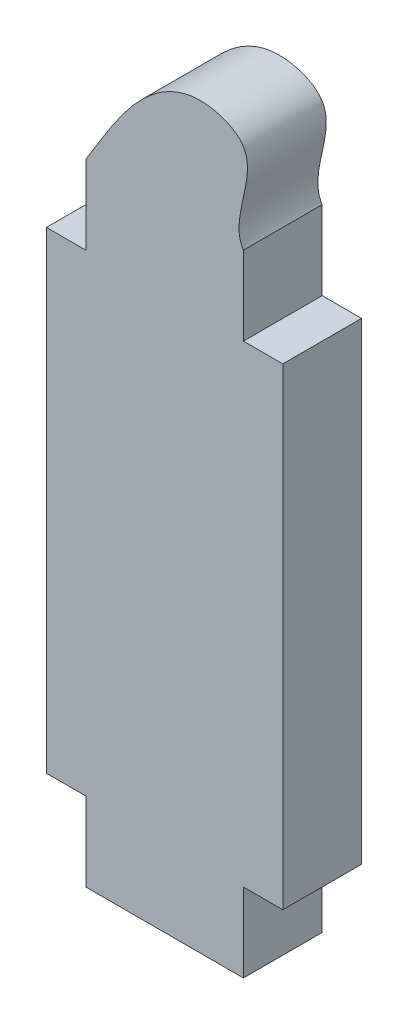
ISO-10303-21;
HEADER;
FILE_DESCRIPTION(('STEP AP214'),'2;1');
FILE_NAME('part.step','',(''),(''),'','','');
FILE_SCHEMA(('AUTOMOTIVE_DESIGN { 1 0 10303 214 1 1 1 1 }'));
ENDSEC;
DATA;
#1=APPLICATION_CONTEXT('core data for automotive mechanical design processes');
#2=APPLICATION_PROTOCOL_DEFINITION('international standard','automotive_design',2000,#1);
#3=PRODUCT_CONTEXT('',#1,'mechanical');
#4=PRODUCT('Part','Part','',(#3));
#5=PRODUCT_RELATED_PRODUCT_CATEGORY('part','',(#4));
#6=PRODUCT_DEFINITION_FORMATION('','',#4);
#7=PRODUCT_DEFINITION_CONTEXT('part definition',#1,'design');
#8=PRODUCT_DEFINITION('design','',#6,#7);
#9=PRODUCT_DEFINITION_SHAPE('','',#8);
#10=(LENGTH_UNIT() NAMED_UNIT(*) SI_UNIT(.MILLI.,.METRE.));
#11=(NAMED_UNIT(*) PLANE_ANGLE_UNIT() SI_UNIT($,.RADIAN.));
#12=(NAMED_UNIT(*) SI_UNIT($,.STERADIAN.) SOLID_ANGLE_UNIT());
#13=UNCERTAINTY_MEASURE_WITH_UNIT(LENGTH_MEASURE(1.E-05),#10,'distance_accuracy_value','');
#14=(GEOMETRIC_REPRESENTATION_CONTEXT(3) GLOBAL_UNCERTAINTY_ASSIGNED_CONTEXT((#13)) GLOBAL_UNIT_ASSIGNED_CONTEXT((#10,
#11,#12)) REPRESENTATION_CONTEXT('',''));
#15=CARTESIAN_POINT('',(0.,0.,0.));
#16=DIRECTION('',(0.,0.,1.));
#17=DIRECTION('',(1.,0.,0.));
#18=AXIS2_PLACEMENT_3D('',#15,#16,#17);
#19=CARTESIAN_POINT('',(-4.7625,0.,3.175));
#20=DIRECTION('',(-1.,0.,0.));
#21=DIRECTION('',(0.,0.,1.));
#22=AXIS2_PLACEMENT_3D('',#19,#20,#21);
#23=PLANE('',#22);
#24=DIRECTION('',(0.,1.,0.));
#25=VECTOR('',#24,1.);
#26=CARTESIAN_POINT('',(-4.7625,0.,0.));
#27=LINE('',#26,#25);
#28=CARTESIAN_POINT('',(-4.7625,-9.525,0.));
#29=VERTEX_POINT('',#28);
#30=CARTESIAN_POINT('',(-4.7625,9.525,0.));
#31=VERTEX_POINT('',#30);
#32=EDGE_CURVE('E153',#29,#31,#27,.T.);
#33=ORIENTED_EDGE('',*,*,#32,.F.);
#34=DIRECTION('',(0.,0.,-1.));
#35=VECTOR('',#34,1.);
#36=CARTESIAN_POINT('',(-4.7625,-9.525,3.175));
#37=LINE('',#36,#35);
#38=CARTESIAN_POINT('',(-4.7625,-9.525,3.175));
#39=VERTEX_POINT('',#38);
#40=EDGE_CURVE('E11',#39,#29,#37,.T.);
#41=ORIENTED_EDGE('',*,*,#40,.F.);
#42=DIRECTION('',(0.,1.,0.));
#43=VECTOR('',#42,1.);
#44=CARTESIAN_POINT('',(-4.7625,0.,3.175));
#45=LINE('',#44,#43);
#46=CARTESIAN_POINT('',(-4.7625,9.525,3.175));
#47=VERTEX_POINT('',#46);
#48=EDGE_CURVE('E216',#39,#47,#45,.T.);
#49=ORIENTED_EDGE('',*,*,#48,.T.);
#50=DIRECTION('',(0.,0.,-1.));
#51=VECTOR('',#50,1.);
#52=CARTESIAN_POINT('',(-4.7625,9.525,3.175));
#53=LINE('',#52,#51);
#54=EDGE_CURVE('E95',#47,#31,#53,.T.);
#55=ORIENTED_EDGE('',*,*,#54,.T.);
#56=EDGE_LOOP('',(#33,#41,#49,#55));
#57=FACE_BOUND('',#56,.T.);
#58=ADVANCED_FACE('F33',(#57),#23,.T.);
#59=CARTESIAN_POINT('',(0.,-9.525,3.175));
#60=DIRECTION('',(0.,-1.,0.));
#61=DIRECTION('',(0.,0.,-1.));
#62=AXIS2_PLACEMENT_3D('',#59,#60,#61);
#63=PLANE('',#62);
#64=DIRECTION('',(-1.,0.,0.));
#65=VECTOR('',#64,1.);
#66=CARTESIAN_POINT('',(0.,-9.525,0.));
#67=LINE('',#66,#65);
#68=CARTESIAN_POINT('',(-3.175,-9.525,0.));
#69=VERTEX_POINT('',#68);
#70=EDGE_CURVE('E156',#69,#29,#67,.T.);
#71=ORIENTED_EDGE('',*,*,#70,.F.);
#72=DIRECTION('',(0.,0.,-1.));
#73=VECTOR('',#72,1.);
#74=CARTESIAN_POINT('',(-3.175,-9.525,3.175));
#75=LINE('',#74,#73);
#76=CARTESIAN_POINT('',(-3.175,-9.525,3.175));
#77=VERTEX_POINT('',#76);
#78=EDGE_CURVE('E41',#77,#69,#75,.T.);
#79=ORIENTED_EDGE('',*,*,#78,.F.);
#80=DIRECTION('',(-1.,0.,0.));
#81=VECTOR('',#80,1.);
#82=CARTESIAN_POINT('',(0.,-9.525,3.175));
#83=LINE('',#82,#81);
#84=EDGE_CURVE('E215',#77,#39,#83,.T.);
#85=ORIENTED_EDGE('',*,*,#84,.T.);
#86=ORIENTED_EDGE('',*,*,#40,.T.);
#87=EDGE_LOOP('',(#71,#79,#85,#86));
#88=FACE_BOUND('',#87,.T.);
#89=ADVANCED_FACE('F214',(#88),#63,.T.);
#90=CARTESIAN_POINT('',(-3.17500000000001,0.,3.175));
#91=DIRECTION('',(1.,0.,0.));
#92=DIRECTION('',(0.,1.,0.));
#93=AXIS2_PLACEMENT_3D('',#90,#91,#92);
#94=PLANE('',#93);
#95=DIRECTION('',(0.,-1.,0.));
#96=VECTOR('',#95,1.);
#97=CARTESIAN_POINT('',(-3.17500000000001,0.,0.));
#98=LINE('',#97,#96);
#99=CARTESIAN_POINT('',(-3.175,-12.7,0.));
#100=VERTEX_POINT('',#99);
#101=EDGE_CURVE('E159',#69,#100,#98,.T.);
#102=ORIENTED_EDGE('',*,*,#101,.T.);
#103=DIRECTION('',(0.,0.,-1.));
#104=VECTOR('',#103,1.);
#105=CARTESIAN_POINT('',(-3.175,-12.7,3.175));
#106=LINE('',#105,#104);
#107=CARTESIAN_POINT('',(-3.175,-12.7,3.175));
#108=VERTEX_POINT('',#107);
#109=EDGE_CURVE('E199',#108,#100,#106,.T.);
#110=ORIENTED_EDGE('',*,*,#109,.F.);
#111=DIRECTION('',(0.,-1.,0.));
#112=VECTOR('',#111,1.);
#113=CARTESIAN_POINT('',(-3.17500000000001,0.,3.175));
#114=LINE('',#113,#112);
#115=EDGE_CURVE('E206',#77,#108,#114,.T.);
#116=ORIENTED_EDGE('',*,*,#115,.F.);
#117=ORIENTED_EDGE('',*,*,#78,.T.);
#118=EDGE_LOOP('',(#102,#110,#116,#117));
#119=FACE_BOUND('',#118,.T.);
#120=ADVANCED_FACE('F204',(#119),#94,.F.);
#121=CARTESIAN_POINT('',(0.,-12.7,3.175));
#122=DIRECTION('',(0.,1.,0.));
#123=DIRECTION('',(0.,0.,1.));
#124=AXIS2_PLACEMENT_3D('',#121,#122,#123);
#125=PLANE('',#124);
#126=DIRECTION('',(1.,0.,0.));
#127=VECTOR('',#126,1.);
#128=CARTESIAN_POINT('',(0.,-12.7,0.));
#129=LINE('',#128,#127);
#130=CARTESIAN_POINT('',(3.175,-12.7,0.));
#131=VERTEX_POINT('',#130);
#132=EDGE_CURVE('E162',#100,#131,#129,.T.);
#133=ORIENTED_EDGE('',*,*,#132,.T.);
#134=DIRECTION('',(0.,0.,-1.));
#135=VECTOR('',#134,1.);
#136=CARTESIAN_POINT('',(3.175,-12.7,3.175));
#137=LINE('',#136,#135);
#138=CARTESIAN_POINT('',(3.175,-12.7,3.175));
#139=VERTEX_POINT('',#138);
#140=EDGE_CURVE('E197',#139,#131,#137,.T.);
#141=ORIENTED_EDGE('',*,*,#140,.F.);
#142=DIRECTION('',(1.,0.,0.));
#143=VECTOR('',#142,1.);
#144=CARTESIAN_POINT('',(0.,-12.7,3.175));
#145=LINE('',#144,#143);
#146=EDGE_CURVE('E222',#108,#139,#145,.T.);
#147=ORIENTED_EDGE('',*,*,#146,.F.);
#148=ORIENTED_EDGE('',*,*,#109,.T.);
#149=EDGE_LOOP('',(#133,#141,#147,#148));
#150=FACE_BOUND('',#149,.T.);
#151=ADVANCED_FACE('F253',(#150),#125,.F.);
#152=CARTESIAN_POINT('',(3.17499999999999,0.,3.175));
#153=DIRECTION('',(1.,0.,0.));
#154=DIRECTION('',(0.,1.,0.));
#155=AXIS2_PLACEMENT_3D('',#152,#153,#154);
#156=PLANE('',#155);
#157=DIRECTION('',(0.,-1.,0.));
#158=VECTOR('',#157,1.);
#159=CARTESIAN_POINT('',(3.17499999999999,0.,0.));
#160=LINE('',#159,#158);
#161=CARTESIAN_POINT('',(3.175,-9.525,0.));
#162=VERTEX_POINT('',#161);
#163=EDGE_CURVE('E165',#162,#131,#160,.T.);
#164=ORIENTED_EDGE('',*,*,#163,.F.);
#165=DIRECTION('',(0.,0.,-1.));
#166=VECTOR('',#165,1.);
#167=CARTESIAN_POINT('',(3.175,-9.525,3.175));
#168=LINE('',#167,#166);
#169=CARTESIAN_POINT('',(3.175,-9.525,3.175));
#170=VERTEX_POINT('',#169);
#171=EDGE_CURVE('E195',#170,#162,#168,.T.);
#172=ORIENTED_EDGE('',*,*,#171,.F.);
#173=DIRECTION('',(0.,-1.,0.));
#174=VECTOR('',#173,1.);
#175=CARTESIAN_POINT('',(3.17499999999999,0.,3.175));
#176=LINE('',#175,#174);
#177=EDGE_CURVE('E224',#170,#139,#176,.T.);
#178=ORIENTED_EDGE('',*,*,#177,.T.);
#179=ORIENTED_EDGE('',*,*,#140,.T.);
#180=EDGE_LOOP('',(#164,#172,#178,#179));
#181=FACE_BOUND('',#180,.T.);
#182=ADVANCED_FACE('F249',(#181),#156,.T.);
#183=CARTESIAN_POINT('',(4.7625,-9.525,0.));
#184=VERTEX_POINT('',#183);
#185=EDGE_CURVE('E160',#184,#162,#67,.T.);
#186=ORIENTED_EDGE('',*,*,#185,.F.);
#187=DIRECTION('',(0.,0.,-1.));
#188=VECTOR('',#187,1.);
#189=CARTESIAN_POINT('',(4.7625,-9.525,3.175));
#190=LINE('',#189,#188);
#191=CARTESIAN_POINT('',(4.7625,-9.525,3.175));
#192=VERTEX_POINT('',#191);
#193=EDGE_CURVE('E193',#192,#184,#190,.T.);
#194=ORIENTED_EDGE('',*,*,#193,.F.);
#195=EDGE_CURVE('E219',#192,#170,#83,.T.);
#196=ORIENTED_EDGE('',*,*,#195,.T.);
#197=ORIENTED_EDGE('',*,*,#171,.T.);
#198=EDGE_LOOP('',(#186,#194,#196,#197));
#199=FACE_BOUND('',#198,.T.);
#200=ADVANCED_FACE('F244',(#199),#63,.T.);
#201=CARTESIAN_POINT('',(4.7625,0.,3.175));
#202=DIRECTION('',(-1.,0.,0.));
#203=DIRECTION('',(0.,0.,1.));
#204=AXIS2_PLACEMENT_3D('',#201,#202,#203);
#205=PLANE('',#204);
#206=DIRECTION('',(0.,1.,0.));
#207=VECTOR('',#206,1.);
#208=CARTESIAN_POINT('',(4.7625,0.,0.));
#209=LINE('',#208,#207);
#210=CARTESIAN_POINT('',(4.7625,9.525,0.));
#211=VERTEX_POINT('',#210);
#212=EDGE_CURVE('E168',#184,#211,#209,.T.);
#213=ORIENTED_EDGE('',*,*,#212,.T.);
#214=DIRECTION('',(0.,0.,-1.));
#215=VECTOR('',#214,1.);
#216=CARTESIAN_POINT('',(4.7625,9.525,3.175));
#217=LINE('',#216,#215);
#218=CARTESIAN_POINT('',(4.7625,9.525,3.175));
#219=VERTEX_POINT('',#218);
#220=EDGE_CURVE('E190',#219,#211,#217,.T.);
#221=ORIENTED_EDGE('',*,*,#220,.F.);
#222=DIRECTION('',(0.,1.,0.));
#223=VECTOR('',#222,1.);
#224=CARTESIAN_POINT('',(4.7625,0.,3.175));
#225=LINE('',#224,#223);
#226=EDGE_CURVE('E227',#192,#219,#225,.T.);
#227=ORIENTED_EDGE('',*,*,#226,.F.);
#228=ORIENTED_EDGE('',*,*,#193,.T.);
#229=EDGE_LOOP('',(#213,#221,#227,#228));
#230=FACE_BOUND('',#229,.T.);
#231=ADVANCED_FACE('F270',(#230),#205,.F.);
#232=CARTESIAN_POINT('',(0.,9.525,3.175));
#233=DIRECTION('',(0.,-1.,0.));
#234=DIRECTION('',(0.,0.,-1.));
#235=AXIS2_PLACEMENT_3D('',#232,#233,#234);
#236=PLANE('',#235);
#237=DIRECTION('',(-1.,0.,0.));
#238=VECTOR('',#237,1.);
#239=CARTESIAN_POINT('',(0.,9.525,0.));
#240=LINE('',#239,#238);
#241=CARTESIAN_POINT('',(3.175,9.525,0.));
#242=VERTEX_POINT('',#241);
#243=EDGE_CURVE('E170',#211,#242,#240,.T.);
#244=ORIENTED_EDGE('',*,*,#243,.T.);
#245=DIRECTION('',(0.,0.,-1.));
#246=VECTOR('',#245,1.);
#247=CARTESIAN_POINT('',(3.175,9.525,3.175));
#248=LINE('',#247,#246);
#249=CARTESIAN_POINT('',(3.175,9.525,3.175));
#250=VERTEX_POINT('',#249);
#251=EDGE_CURVE('E187',#250,#242,#248,.T.);
#252=ORIENTED_EDGE('',*,*,#251,.F.);
#253=DIRECTION('',(-1.,0.,0.));
#254=VECTOR('',#253,1.);
#255=CARTESIAN_POINT('',(0.,9.525,3.175));
#256=LINE('',#255,#254);
#257=EDGE_CURVE('E147',#219,#250,#256,.T.);
#258=ORIENTED_EDGE('',*,*,#257,.F.);
#259=ORIENTED_EDGE('',*,*,#220,.T.);
#260=EDGE_LOOP('',(#244,#252,#258,#259));
#261=FACE_BOUND('',#260,.T.);
#262=ADVANCED_FACE('F234',(#261),#236,.F.);
#263=CARTESIAN_POINT('',(3.175,0.,3.175));
#264=DIRECTION('',(-1.,0.,0.));
#265=DIRECTION('',(0.,0.,1.));
#266=AXIS2_PLACEMENT_3D('',#263,#264,#265);
#267=PLANE('',#266);
#268=DIRECTION('',(0.,1.,0.));
#269=VECTOR('',#268,1.);
#270=CARTESIAN_POINT('',(3.175,0.,0.));
#271=LINE('',#270,#269);
#272=CARTESIAN_POINT('',(3.175,12.7,0.));
#273=VERTEX_POINT('',#272);
#274=EDGE_CURVE('E172',#242,#273,#271,.T.);
#275=ORIENTED_EDGE('',*,*,#274,.T.);
#276=DIRECTION('',(0.,0.,-1.));
#277=VECTOR('',#276,1.);
#278=CARTESIAN_POINT('',(3.175,12.7,3.175));
#279=LINE('',#278,#277);
#280=CARTESIAN_POINT('',(3.175,12.7,3.175));
#281=VERTEX_POINT('',#280);
#282=EDGE_CURVE('E136',#281,#273,#279,.T.);
#283=ORIENTED_EDGE('',*,*,#282,.F.);
#284=DIRECTION('',(0.,1.,0.));
#285=VECTOR('',#284,1.);
#286=CARTESIAN_POINT('',(3.175,0.,3.175));
#287=LINE('',#286,#285);
#288=EDGE_CURVE('E141',#250,#281,#287,.T.);
#289=ORIENTED_EDGE('',*,*,#288,.F.);
#290=ORIENTED_EDGE('',*,*,#251,.T.);
#291=EDGE_LOOP('',(#275,#283,#289,#290));
#292=FACE_BOUND('',#291,.T.);
#293=ADVANCED_FACE('F238',(#292),#267,.F.);
#294=CARTESIAN_POINT('',(-3.175,12.7,3.175));
#295=CARTESIAN_POINT('',(-2.2138117611379,14.1735923111968,3.175));
#296=CARTESIAN_POINT('',(-0.385937212467638,17.9716877260222,3.175));
#297=CARTESIAN_POINT('',(4.31508925997065,16.2397463109345,3.175));
#298=CARTESIAN_POINT('',(2.57651001553073,13.6162403457416,3.175));
#299=CARTESIAN_POINT('',(3.175,12.7,3.175));
#300=B_SPLINE_CURVE_WITH_KNOTS('',3,(#294,#295,#296,#297,#298,#299),.UNSPECIFIED.,.F.,.F.,(4,1,
1,4),(0.,0.552544754896248,0.698480670384451,1.),.UNSPECIFIED.);
#301=DIRECTION('',(0.,0.,-1.));
#302=VECTOR('',#301,1.);
#303=SURFACE_OF_LINEAR_EXTRUSION('',#300,#302);
#304=CARTESIAN_POINT('',(-3.175,12.7,0.));
#305=CARTESIAN_POINT('',(-2.2138117611379,14.1735923111968,0.));
#306=CARTESIAN_POINT('',(-0.385937212467638,17.9716877260222,0.));
#307=CARTESIAN_POINT('',(4.31508925997065,16.2397463109345,0.));
#308=CARTESIAN_POINT('',(2.57651001553073,13.6162403457416,0.));
#309=CARTESIAN_POINT('',(3.175,12.7,0.));
#310=B_SPLINE_CURVE_WITH_KNOTS('',3,(#304,#305,#306,#307,#308,#309),.UNSPECIFIED.,.F.,.F.,(4,1,
1,4),(0.,0.552544754896248,0.698480670384451,1.),.UNSPECIFIED.);
#311=CARTESIAN_POINT('',(-3.175,12.7,0.));
#312=VERTEX_POINT('',#311);
#313=EDGE_CURVE('E131',#312,#273,#310,.T.);
#314=ORIENTED_EDGE('',*,*,#313,.F.);
#315=DIRECTION('',(0.,0.,-1.));
#316=VECTOR('',#315,1.);
#317=CARTESIAN_POINT('',(-3.175,12.7,3.175));
#318=LINE('',#317,#316);
#319=CARTESIAN_POINT('',(-3.175,12.7,3.175));
#320=VERTEX_POINT('',#319);
#321=EDGE_CURVE('E126',#320,#312,#318,.T.);
#322=ORIENTED_EDGE('',*,*,#321,.F.);
#323=EDGE_CURVE('E129',#320,#281,#300,.T.);
#324=ORIENTED_EDGE('',*,*,#323,.T.);
#325=ORIENTED_EDGE('',*,*,#282,.T.);
#326=EDGE_LOOP('',(#314,#322,#324,#325));
#327=FACE_BOUND('',#326,.T.);
#328=ADVANCED_FACE('F128',(#327),#303,.T.);
#329=CARTESIAN_POINT('',(-3.175,0.,3.175));
#330=DIRECTION('',(-1.,0.,0.));
#331=DIRECTION('',(0.,0.,1.));
#332=AXIS2_PLACEMENT_3D('',#329,#330,#331);
#333=PLANE('',#332);
#334=DIRECTION('',(0.,1.,0.));
#335=VECTOR('',#334,1.);
#336=CARTESIAN_POINT('',(-3.175,0.,0.));
#337=LINE('',#336,#335);
#338=CARTESIAN_POINT('',(-3.175,9.525,0.));
#339=VERTEX_POINT('',#338);
#340=EDGE_CURVE('E179',#339,#312,#337,.T.);
#341=ORIENTED_EDGE('',*,*,#340,.F.);
#342=DIRECTION('',(0.,0.,-1.));
#343=VECTOR('',#342,1.);
#344=CARTESIAN_POINT('',(-3.175,9.525,3.175));
#345=LINE('',#344,#343);
#346=CARTESIAN_POINT('',(-3.175,9.525,3.175));
#347=VERTEX_POINT('',#346);
#348=EDGE_CURVE('E88',#347,#339,#345,.T.);
#349=ORIENTED_EDGE('',*,*,#348,.F.);
#350=DIRECTION('',(0.,1.,0.));
#351=VECTOR('',#350,1.);
#352=CARTESIAN_POINT('',(-3.175,0.,3.175));
#353=LINE('',#352,#351);
#354=EDGE_CURVE('E139',#347,#320,#353,.T.);
#355=ORIENTED_EDGE('',*,*,#354,.T.);
#356=ORIENTED_EDGE('',*,*,#321,.T.);
#357=EDGE_LOOP('',(#341,#349,#355,#356));
#358=FACE_BOUND('',#357,.T.);
#359=ADVANCED_FACE('F144',(#358),#333,.T.);
#360=EDGE_CURVE('E173',#339,#31,#240,.T.);
#361=ORIENTED_EDGE('',*,*,#360,.T.);
#362=ORIENTED_EDGE('',*,*,#54,.F.);
#363=EDGE_CURVE('E49',#347,#47,#256,.T.);
#364=ORIENTED_EDGE('',*,*,#363,.F.);
#365=ORIENTED_EDGE('',*,*,#348,.T.);
#366=EDGE_LOOP('',(#361,#362,#364,#365));
#367=FACE_BOUND('',#366,.T.);
#368=ADVANCED_FACE('F278',(#367),#236,.F.);
#369=CARTESIAN_POINT('',(0.,0.,3.175));
#370=DIRECTION('',(0.,0.,1.));
#371=DIRECTION('',(1.,0.,0.));
#372=AXIS2_PLACEMENT_3D('',#369,#370,#371);
#373=PLANE('',#372);
#374=ORIENTED_EDGE('',*,*,#48,.F.);
#375=ORIENTED_EDGE('',*,*,#84,.F.);
#376=ORIENTED_EDGE('',*,*,#115,.T.);
#377=ORIENTED_EDGE('',*,*,#146,.T.);
#378=ORIENTED_EDGE('',*,*,#177,.F.);
#379=ORIENTED_EDGE('',*,*,#195,.F.);
#380=ORIENTED_EDGE('',*,*,#226,.T.);
#381=ORIENTED_EDGE('',*,*,#257,.T.);
#382=ORIENTED_EDGE('',*,*,#288,.T.);
#383=ORIENTED_EDGE('',*,*,#323,.F.);
#384=ORIENTED_EDGE('',*,*,#354,.F.);
#385=ORIENTED_EDGE('',*,*,#363,.T.);
#386=EDGE_LOOP('',(#374,#375,#376,#377,#378,#379,#380,#381,#382,#383,#384,#385));
#387=FACE_BOUND('',#386,.T.);
#388=ADVANCED_FACE('F138',(#387),#373,.T.);
#389=CARTESIAN_POINT('',(0.,0.,0.));
#390=DIRECTION('',(0.,0.,1.));
#391=DIRECTION('',(1.,0.,0.));
#392=AXIS2_PLACEMENT_3D('',#389,#390,#391);
#393=PLANE('',#392);
#394=ORIENTED_EDGE('',*,*,#32,.T.);
#395=ORIENTED_EDGE('',*,*,#360,.F.);
#396=ORIENTED_EDGE('',*,*,#340,.T.);
#397=ORIENTED_EDGE('',*,*,#313,.T.);
#398=ORIENTED_EDGE('',*,*,#274,.F.);
#399=ORIENTED_EDGE('',*,*,#243,.F.);
#400=ORIENTED_EDGE('',*,*,#212,.F.);
#401=ORIENTED_EDGE('',*,*,#185,.T.);
#402=ORIENTED_EDGE('',*,*,#163,.T.);
#403=ORIENTED_EDGE('',*,*,#132,.F.);
#404=ORIENTED_EDGE('',*,*,#101,.F.);
#405=ORIENTED_EDGE('',*,*,#70,.T.);
#406=EDGE_LOOP('',(#394,#395,#396,#397,#398,#399,#400,#401,#402,#403,#404,#405));
#407=FACE_BOUND('',#406,.T.);
#408=ADVANCED_FACE('F213',(#407),#393,.F.);
#409=CLOSED_SHELL('',(#58,#89,#120,#151,#182,#200,#231,#262,#293,#328,#359,#368,#388,#408));
#410=MANIFOLD_SOLID_BREP('B2',#409);
#411=ADVANCED_BREP_SHAPE_REPRESENTATION('',(#18,#410),#14);
#412=SHAPE_DEFINITION_REPRESENTATION(#9,#411);
ENDSEC;
END-ISO-10303-21;
